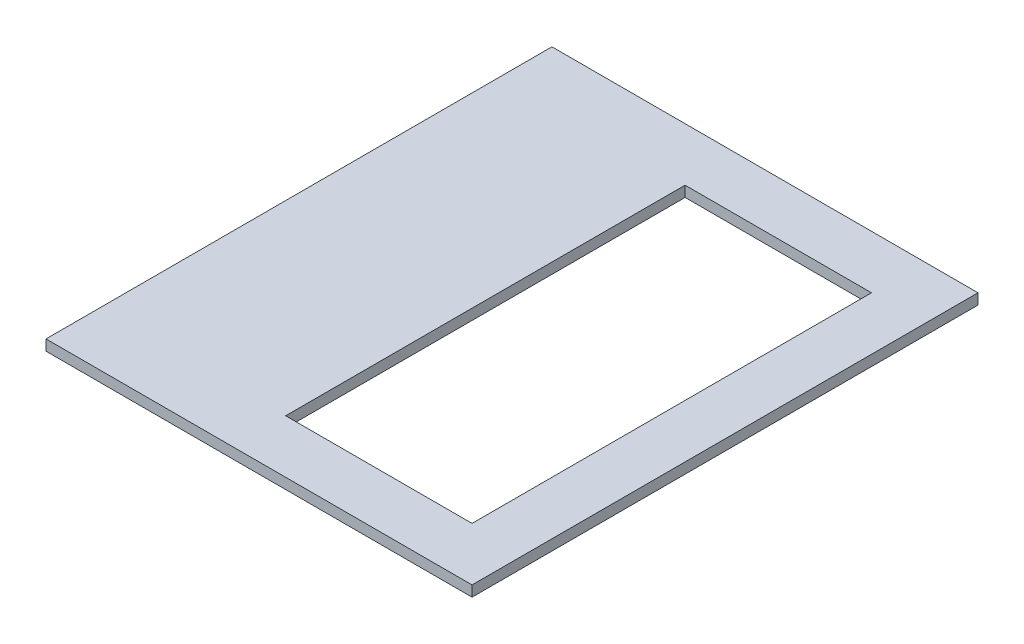
ISO-10303-21;
HEADER;
FILE_DESCRIPTION(('STEP AP214'),'2;1');
FILE_NAME('part.step','',(''),(''),'','','');
FILE_SCHEMA(('AUTOMOTIVE_DESIGN { 1 0 10303 214 1 1 1 1 }'));
ENDSEC;
DATA;
#1=APPLICATION_CONTEXT('core data for automotive mechanical design processes');
#2=APPLICATION_PROTOCOL_DEFINITION('international standard','automotive_design',2000,#1);
#3=PRODUCT_CONTEXT('',#1,'mechanical');
#4=PRODUCT('Part','Part','',(#3));
#5=PRODUCT_RELATED_PRODUCT_CATEGORY('part','',(#4));
#6=PRODUCT_DEFINITION_FORMATION('','',#4);
#7=PRODUCT_DEFINITION_CONTEXT('part definition',#1,'design');
#8=PRODUCT_DEFINITION('design','',#6,#7);
#9=PRODUCT_DEFINITION_SHAPE('','',#8);
#10=(LENGTH_UNIT() NAMED_UNIT(*) SI_UNIT(.MILLI.,.METRE.));
#11=(NAMED_UNIT(*) PLANE_ANGLE_UNIT() SI_UNIT($,.RADIAN.));
#12=(NAMED_UNIT(*) SI_UNIT($,.STERADIAN.) SOLID_ANGLE_UNIT());
#13=UNCERTAINTY_MEASURE_WITH_UNIT(LENGTH_MEASURE(1.E-05),#10,'distance_accuracy_value','');
#14=(GEOMETRIC_REPRESENTATION_CONTEXT(3) GLOBAL_UNCERTAINTY_ASSIGNED_CONTEXT((#13)) GLOBAL_UNIT_ASSIGNED_CONTEXT((#10,
#11,#12)) REPRESENTATION_CONTEXT('',''));
#15=CARTESIAN_POINT('',(0.,0.,0.));
#16=DIRECTION('',(0.,0.,1.));
#17=DIRECTION('',(1.,0.,0.));
#18=AXIS2_PLACEMENT_3D('',#15,#16,#17);
#19=CARTESIAN_POINT('',(0.,4.,0.));
#20=DIRECTION('',(0.,1.,0.));
#21=DIRECTION('',(0.,0.,1.));
#22=AXIS2_PLACEMENT_3D('',#19,#20,#21);
#23=PLANE('',#22);
#24=DIRECTION('',(-1.,0.,0.));
#25=VECTOR('',#24,1.);
#26=CARTESIAN_POINT('',(-55.,4.,-95.));
#27=LINE('',#26,#25);
#28=CARTESIAN_POINT('',(55.,4.,-95.));
#29=VERTEX_POINT('',#28);
#30=CARTESIAN_POINT('',(-105.,4.,-95.));
#31=VERTEX_POINT('',#30);
#32=EDGE_CURVE('E134',#29,#31,#27,.T.);
#33=ORIENTED_EDGE('',*,*,#32,.T.);
#34=DIRECTION('',(0.,0.,1.));
#35=VECTOR('',#34,1.);
#36=CARTESIAN_POINT('',(-105.,4.,-95.));
#37=LINE('',#36,#35);
#38=CARTESIAN_POINT('',(-105.,4.,95.));
#39=VERTEX_POINT('',#38);
#40=EDGE_CURVE('E137',#31,#39,#37,.T.);
#41=ORIENTED_EDGE('',*,*,#40,.T.);
#42=DIRECTION('',(1.,0.,0.));
#43=VECTOR('',#42,1.);
#44=CARTESIAN_POINT('',(-105.,4.,95.));
#45=LINE('',#44,#43);
#46=CARTESIAN_POINT('',(55.,4.,95.));
#47=VERTEX_POINT('',#46);
#48=EDGE_CURVE('E140',#39,#47,#45,.T.);
#49=ORIENTED_EDGE('',*,*,#48,.T.);
#50=DIRECTION('',(0.,0.,-1.));
#51=VECTOR('',#50,1.);
#52=CARTESIAN_POINT('',(55.,4.,-95.));
#53=LINE('',#52,#51);
#54=EDGE_CURVE('E142',#47,#29,#53,.T.);
#55=ORIENTED_EDGE('',*,*,#54,.T.);
#56=EDGE_LOOP('',(#33,#41,#49,#55));
#57=FACE_BOUND('',#56,.T.);
#58=DIRECTION('',(-1.,0.,0.));
#59=VECTOR('',#58,1.);
#60=CARTESIAN_POINT('',(-35.,4.,-75.));
#61=LINE('',#60,#59);
#62=CARTESIAN_POINT('',(35.,4.,-75.));
#63=VERTEX_POINT('',#62);
#64=CARTESIAN_POINT('',(-35.,4.,-75.));
#65=VERTEX_POINT('',#64);
#66=EDGE_CURVE('E106',#63,#65,#61,.T.);
#67=ORIENTED_EDGE('',*,*,#66,.F.);
#68=DIRECTION('',(0.,0.,-1.));
#69=VECTOR('',#68,1.);
#70=CARTESIAN_POINT('',(35.,4.,-75.));
#71=LINE('',#70,#69);
#72=CARTESIAN_POINT('',(35.,4.,75.));
#73=VERTEX_POINT('',#72);
#74=EDGE_CURVE('E98',#73,#63,#71,.T.);
#75=ORIENTED_EDGE('',*,*,#74,.F.);
#76=DIRECTION('',(1.,0.,0.));
#77=VECTOR('',#76,1.);
#78=CARTESIAN_POINT('',(-35.,4.,75.));
#79=LINE('',#78,#77);
#80=CARTESIAN_POINT('',(-35.,4.,75.));
#81=VERTEX_POINT('',#80);
#82=EDGE_CURVE('E120',#81,#73,#79,.T.);
#83=ORIENTED_EDGE('',*,*,#82,.F.);
#84=DIRECTION('',(0.,0.,1.));
#85=VECTOR('',#84,1.);
#86=CARTESIAN_POINT('',(-35.,4.,-75.));
#87=LINE('',#86,#85);
#88=EDGE_CURVE('E118',#65,#81,#87,.T.);
#89=ORIENTED_EDGE('',*,*,#88,.F.);
#90=EDGE_LOOP('',(#67,#75,#83,#89));
#91=FACE_BOUND('',#90,.T.);
#92=ADVANCED_FACE('F33',(#57,#91),#23,.T.);
#93=CARTESIAN_POINT('',(0.,0.,0.));
#94=DIRECTION('',(0.,1.,0.));
#95=DIRECTION('',(0.,0.,1.));
#96=AXIS2_PLACEMENT_3D('',#93,#94,#95);
#97=PLANE('',#96);
#98=DIRECTION('',(0.,0.,1.));
#99=VECTOR('',#98,1.);
#100=CARTESIAN_POINT('',(-105.,0.,-95.));
#101=LINE('',#100,#99);
#102=CARTESIAN_POINT('',(-105.,0.,-95.));
#103=VERTEX_POINT('',#102);
#104=CARTESIAN_POINT('',(-105.,0.,95.));
#105=VERTEX_POINT('',#104);
#106=EDGE_CURVE('E114',#103,#105,#101,.T.);
#107=ORIENTED_EDGE('',*,*,#106,.F.);
#108=DIRECTION('',(-1.,0.,0.));
#109=VECTOR('',#108,1.);
#110=CARTESIAN_POINT('',(-55.,0.,-95.));
#111=LINE('',#110,#109);
#112=CARTESIAN_POINT('',(55.,0.,-95.));
#113=VERTEX_POINT('',#112);
#114=EDGE_CURVE('E138',#113,#103,#111,.T.);
#115=ORIENTED_EDGE('',*,*,#114,.F.);
#116=DIRECTION('',(0.,0.,-1.));
#117=VECTOR('',#116,1.);
#118=CARTESIAN_POINT('',(55.,0.,-95.));
#119=LINE('',#118,#117);
#120=CARTESIAN_POINT('',(55.,0.,95.));
#121=VERTEX_POINT('',#120);
#122=EDGE_CURVE('E150',#121,#113,#119,.T.);
#123=ORIENTED_EDGE('',*,*,#122,.F.);
#124=DIRECTION('',(1.,0.,0.));
#125=VECTOR('',#124,1.);
#126=CARTESIAN_POINT('',(-55.,0.,95.));
#127=LINE('',#126,#125);
#128=EDGE_CURVE('E148',#105,#121,#127,.T.);
#129=ORIENTED_EDGE('',*,*,#128,.F.);
#130=EDGE_LOOP('',(#107,#115,#123,#129));
#131=FACE_BOUND('',#130,.T.);
#132=DIRECTION('',(0.,0.,-1.));
#133=VECTOR('',#132,1.);
#134=CARTESIAN_POINT('',(35.,0.,-75.));
#135=LINE('',#134,#133);
#136=CARTESIAN_POINT('',(35.,0.,75.));
#137=VERTEX_POINT('',#136);
#138=CARTESIAN_POINT('',(35.,0.,-75.));
#139=VERTEX_POINT('',#138);
#140=EDGE_CURVE('E56',#137,#139,#135,.T.);
#141=ORIENTED_EDGE('',*,*,#140,.T.);
#142=DIRECTION('',(-1.,0.,0.));
#143=VECTOR('',#142,1.);
#144=CARTESIAN_POINT('',(-35.,0.,-75.));
#145=LINE('',#144,#143);
#146=CARTESIAN_POINT('',(-35.,0.,-75.));
#147=VERTEX_POINT('',#146);
#148=EDGE_CURVE('E113',#139,#147,#145,.T.);
#149=ORIENTED_EDGE('',*,*,#148,.T.);
#150=DIRECTION('',(0.,0.,1.));
#151=VECTOR('',#150,1.);
#152=CARTESIAN_POINT('',(-35.,0.,-75.));
#153=LINE('',#152,#151);
#154=CARTESIAN_POINT('',(-35.,0.,75.));
#155=VERTEX_POINT('',#154);
#156=EDGE_CURVE('E126',#147,#155,#153,.T.);
#157=ORIENTED_EDGE('',*,*,#156,.T.);
#158=DIRECTION('',(1.,0.,0.));
#159=VECTOR('',#158,1.);
#160=CARTESIAN_POINT('',(-35.,0.,75.));
#161=LINE('',#160,#159);
#162=EDGE_CURVE('E107',#155,#137,#161,.T.);
#163=ORIENTED_EDGE('',*,*,#162,.T.);
#164=EDGE_LOOP('',(#141,#149,#157,#163));
#165=FACE_BOUND('',#164,.T.);
#166=ADVANCED_FACE('F168',(#131,#165),#97,.F.);
#167=CARTESIAN_POINT('',(-105.,4.,-95.));
#168=DIRECTION('',(1.,0.,0.));
#169=DIRECTION('',(0.,0.,-1.));
#170=AXIS2_PLACEMENT_3D('',#167,#168,#169);
#171=PLANE('',#170);
#172=ORIENTED_EDGE('',*,*,#106,.T.);
#173=DIRECTION('',(0.,-1.,0.));
#174=VECTOR('',#173,1.);
#175=CARTESIAN_POINT('',(-105.,4.,95.));
#176=LINE('',#175,#174);
#177=EDGE_CURVE('E41',#39,#105,#176,.T.);
#178=ORIENTED_EDGE('',*,*,#177,.F.);
#179=ORIENTED_EDGE('',*,*,#40,.F.);
#180=DIRECTION('',(0.,-1.,0.));
#181=VECTOR('',#180,1.);
#182=CARTESIAN_POINT('',(-105.,4.,-95.));
#183=LINE('',#182,#181);
#184=EDGE_CURVE('E11',#31,#103,#183,.T.);
#185=ORIENTED_EDGE('',*,*,#184,.T.);
#186=EDGE_LOOP('',(#172,#178,#179,#185));
#187=FACE_BOUND('',#186,.T.);
#188=ADVANCED_FACE('F35',(#187),#171,.F.);
#189=CARTESIAN_POINT('',(-55.,4.,95.));
#190=DIRECTION('',(0.,0.,-1.));
#191=DIRECTION('',(-1.,0.,0.));
#192=AXIS2_PLACEMENT_3D('',#189,#190,#191);
#193=PLANE('',#192);
#194=ORIENTED_EDGE('',*,*,#128,.T.);
#195=DIRECTION('',(0.,-1.,0.));
#196=VECTOR('',#195,1.);
#197=CARTESIAN_POINT('',(55.,4.,95.));
#198=LINE('',#197,#196);
#199=EDGE_CURVE('E155',#47,#121,#198,.T.);
#200=ORIENTED_EDGE('',*,*,#199,.F.);
#201=ORIENTED_EDGE('',*,*,#48,.F.);
#202=ORIENTED_EDGE('',*,*,#177,.T.);
#203=EDGE_LOOP('',(#194,#200,#201,#202));
#204=FACE_BOUND('',#203,.T.);
#205=ADVANCED_FACE('F161',(#204),#193,.F.);
#206=CARTESIAN_POINT('',(55.,4.,-95.));
#207=DIRECTION('',(-1.,0.,0.));
#208=DIRECTION('',(0.,0.,1.));
#209=AXIS2_PLACEMENT_3D('',#206,#207,#208);
#210=PLANE('',#209);
#211=ORIENTED_EDGE('',*,*,#122,.T.);
#212=DIRECTION('',(0.,-1.,0.));
#213=VECTOR('',#212,1.);
#214=CARTESIAN_POINT('',(55.,4.,-95.));
#215=LINE('',#214,#213);
#216=EDGE_CURVE('E145',#29,#113,#215,.T.);
#217=ORIENTED_EDGE('',*,*,#216,.F.);
#218=ORIENTED_EDGE('',*,*,#54,.F.);
#219=ORIENTED_EDGE('',*,*,#199,.T.);
#220=EDGE_LOOP('',(#211,#217,#218,#219));
#221=FACE_BOUND('',#220,.T.);
#222=ADVANCED_FACE('F173',(#221),#210,.F.);
#223=CARTESIAN_POINT('',(-55.,4.,-95.));
#224=DIRECTION('',(0.,0.,1.));
#225=DIRECTION('',(1.,0.,0.));
#226=AXIS2_PLACEMENT_3D('',#223,#224,#225);
#227=PLANE('',#226);
#228=ORIENTED_EDGE('',*,*,#114,.T.);
#229=ORIENTED_EDGE('',*,*,#184,.F.);
#230=ORIENTED_EDGE('',*,*,#32,.F.);
#231=ORIENTED_EDGE('',*,*,#216,.T.);
#232=EDGE_LOOP('',(#228,#229,#230,#231));
#233=FACE_BOUND('',#232,.T.);
#234=ADVANCED_FACE('F176',(#233),#227,.F.);
#235=CARTESIAN_POINT('',(35.,4.,-75.));
#236=DIRECTION('',(-1.,0.,0.));
#237=DIRECTION('',(0.,0.,1.));
#238=AXIS2_PLACEMENT_3D('',#235,#236,#237);
#239=PLANE('',#238);
#240=ORIENTED_EDGE('',*,*,#140,.F.);
#241=DIRECTION('',(0.,-1.,0.));
#242=VECTOR('',#241,1.);
#243=CARTESIAN_POINT('',(35.,4.,75.));
#244=LINE('',#243,#242);
#245=EDGE_CURVE('E102',#73,#137,#244,.T.);
#246=ORIENTED_EDGE('',*,*,#245,.F.);
#247=ORIENTED_EDGE('',*,*,#74,.T.);
#248=DIRECTION('',(0.,-1.,0.));
#249=VECTOR('',#248,1.);
#250=CARTESIAN_POINT('',(35.,4.,-75.));
#251=LINE('',#250,#249);
#252=EDGE_CURVE('E101',#63,#139,#251,.T.);
#253=ORIENTED_EDGE('',*,*,#252,.T.);
#254=EDGE_LOOP('',(#240,#246,#247,#253));
#255=FACE_BOUND('',#254,.T.);
#256=ADVANCED_FACE('F100',(#255),#239,.T.);
#257=CARTESIAN_POINT('',(-35.,4.,-75.));
#258=DIRECTION('',(0.,0.,1.));
#259=DIRECTION('',(1.,0.,0.));
#260=AXIS2_PLACEMENT_3D('',#257,#258,#259);
#261=PLANE('',#260);
#262=ORIENTED_EDGE('',*,*,#148,.F.);
#263=ORIENTED_EDGE('',*,*,#252,.F.);
#264=ORIENTED_EDGE('',*,*,#66,.T.);
#265=DIRECTION('',(0.,-1.,0.));
#266=VECTOR('',#265,1.);
#267=CARTESIAN_POINT('',(-35.,4.,-75.));
#268=LINE('',#267,#266);
#269=EDGE_CURVE('E115',#65,#147,#268,.T.);
#270=ORIENTED_EDGE('',*,*,#269,.T.);
#271=EDGE_LOOP('',(#262,#263,#264,#270));
#272=FACE_BOUND('',#271,.T.);
#273=ADVANCED_FACE('F110',(#272),#261,.T.);
#274=CARTESIAN_POINT('',(-35.,4.,-75.));
#275=DIRECTION('',(1.,0.,0.));
#276=DIRECTION('',(0.,0.,-1.));
#277=AXIS2_PLACEMENT_3D('',#274,#275,#276);
#278=PLANE('',#277);
#279=ORIENTED_EDGE('',*,*,#156,.F.);
#280=ORIENTED_EDGE('',*,*,#269,.F.);
#281=ORIENTED_EDGE('',*,*,#88,.T.);
#282=DIRECTION('',(0.,-1.,0.));
#283=VECTOR('',#282,1.);
#284=CARTESIAN_POINT('',(-35.,4.,75.));
#285=LINE('',#284,#283);
#286=EDGE_CURVE('E48',#81,#155,#285,.T.);
#287=ORIENTED_EDGE('',*,*,#286,.T.);
#288=EDGE_LOOP('',(#279,#280,#281,#287));
#289=FACE_BOUND('',#288,.T.);
#290=ADVANCED_FACE('F242',(#289),#278,.T.);
#291=CARTESIAN_POINT('',(-35.,4.,75.));
#292=DIRECTION('',(0.,0.,-1.));
#293=DIRECTION('',(-1.,0.,0.));
#294=AXIS2_PLACEMENT_3D('',#291,#292,#293);
#295=PLANE('',#294);
#296=ORIENTED_EDGE('',*,*,#162,.F.);
#297=ORIENTED_EDGE('',*,*,#286,.F.);
#298=ORIENTED_EDGE('',*,*,#82,.T.);
#299=ORIENTED_EDGE('',*,*,#245,.T.);
#300=EDGE_LOOP('',(#296,#297,#298,#299));
#301=FACE_BOUND('',#300,.T.);
#302=ADVANCED_FACE('F249',(#301),#295,.T.);
#303=CLOSED_SHELL('',(#92,#166,#188,#205,#222,#234,#256,#273,#290,#302));
#304=MANIFOLD_SOLID_BREP('B2',#303);
#305=ADVANCED_BREP_SHAPE_REPRESENTATION('',(#18,#304),#14);
#306=SHAPE_DEFINITION_REPRESENTATION(#9,#305);
ENDSEC;
END-ISO-10303-21;
